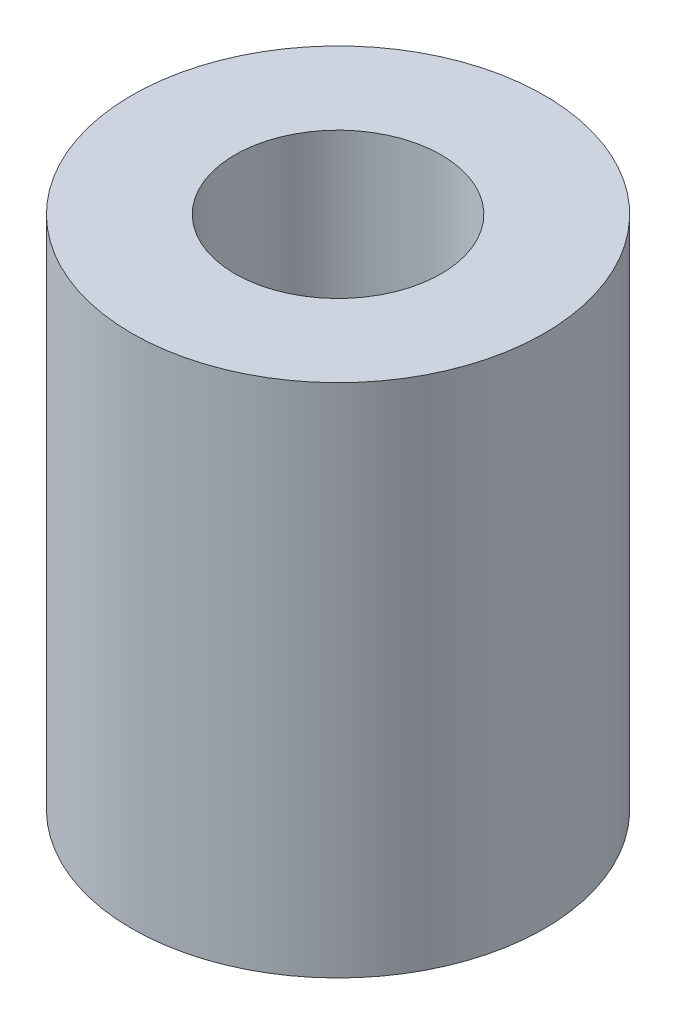
ISO-10303-21;
HEADER;
FILE_DESCRIPTION(('STEP AP214'),'2;1');
FILE_NAME('part.step','',(''),(''),'','','');
FILE_SCHEMA(('AUTOMOTIVE_DESIGN { 1 0 10303 214 1 1 1 1 }'));
ENDSEC;
DATA;
#1=APPLICATION_CONTEXT('core data for automotive mechanical design processes');
#2=APPLICATION_PROTOCOL_DEFINITION('international standard','automotive_design',2000,#1);
#3=PRODUCT_CONTEXT('',#1,'mechanical');
#4=PRODUCT('Part','Part','',(#3));
#5=PRODUCT_RELATED_PRODUCT_CATEGORY('part','',(#4));
#6=PRODUCT_DEFINITION_FORMATION('','',#4);
#7=PRODUCT_DEFINITION_CONTEXT('part definition',#1,'design');
#8=PRODUCT_DEFINITION('design','',#6,#7);
#9=PRODUCT_DEFINITION_SHAPE('','',#8);
#10=(LENGTH_UNIT() NAMED_UNIT(*) SI_UNIT(.MILLI.,.METRE.));
#11=(NAMED_UNIT(*) PLANE_ANGLE_UNIT() SI_UNIT($,.RADIAN.));
#12=(NAMED_UNIT(*) SI_UNIT($,.STERADIAN.) SOLID_ANGLE_UNIT());
#13=UNCERTAINTY_MEASURE_WITH_UNIT(LENGTH_MEASURE(1.E-05),#10,'distance_accuracy_value','');
#14=(GEOMETRIC_REPRESENTATION_CONTEXT(3) GLOBAL_UNCERTAINTY_ASSIGNED_CONTEXT((#13)) GLOBAL_UNIT_ASSIGNED_CONTEXT((#10,
#11,#12)) REPRESENTATION_CONTEXT('',''));
#15=CARTESIAN_POINT('',(0.,0.,0.));
#16=DIRECTION('',(0.,0.,1.));
#17=DIRECTION('',(1.,0.,0.));
#18=AXIS2_PLACEMENT_3D('',#15,#16,#17);
#19=CARTESIAN_POINT('',(0.,5.,0.));
#20=DIRECTION('',(0.,1.,0.));
#21=DIRECTION('',(0.,0.,1.));
#22=AXIS2_PLACEMENT_3D('',#19,#20,#21);
#23=PLANE('',#22);
#24=CARTESIAN_POINT('',(0.,5.,0.));
#25=DIRECTION('',(0.,1.,0.));
#26=DIRECTION('',(0.,0.,1.));
#27=AXIS2_PLACEMENT_3D('',#24,#25,#26);
#28=CIRCLE('',#27,2.);
#29=CARTESIAN_POINT('',(0.,5.,2.));
#30=VERTEX_POINT('',#29);
#31=EDGE_CURVE('E10',#30,#30,#28,.T.);
#32=ORIENTED_EDGE('',*,*,#31,.T.);
#33=EDGE_LOOP('',(#32));
#34=FACE_BOUND('',#33,.T.);
#35=CARTESIAN_POINT('',(0.,5.,0.));
#36=DIRECTION('',(0.,1.,0.));
#37=DIRECTION('',(0.,0.,1.));
#38=AXIS2_PLACEMENT_3D('',#35,#36,#37);
#39=CIRCLE('',#38,1.);
#40=CARTESIAN_POINT('',(0.,5.,1.));
#41=VERTEX_POINT('',#40);
#42=EDGE_CURVE('E56',#41,#41,#39,.T.);
#43=ORIENTED_EDGE('',*,*,#42,.F.);
#44=EDGE_LOOP('',(#43));
#45=FACE_BOUND('',#44,.T.);
#46=ADVANCED_FACE('F43',(#34,#45),#23,.T.);
#47=CARTESIAN_POINT('',(0.,0.,0.));
#48=DIRECTION('',(0.,1.,0.));
#49=DIRECTION('',(0.,0.,1.));
#50=AXIS2_PLACEMENT_3D('',#47,#48,#49);
#51=PLANE('',#50);
#52=CARTESIAN_POINT('',(0.,0.,0.));
#53=DIRECTION('',(0.,1.,0.));
#54=DIRECTION('',(0.,0.,1.));
#55=AXIS2_PLACEMENT_3D('',#52,#53,#54);
#56=CIRCLE('',#55,2.);
#57=CARTESIAN_POINT('',(0.,0.,2.));
#58=VERTEX_POINT('',#57);
#59=EDGE_CURVE('E47',#58,#58,#56,.T.);
#60=ORIENTED_EDGE('',*,*,#59,.F.);
#61=EDGE_LOOP('',(#60));
#62=FACE_BOUND('',#61,.T.);
#63=CARTESIAN_POINT('',(0.,0.,0.));
#64=DIRECTION('',(0.,1.,0.));
#65=DIRECTION('',(0.,0.,1.));
#66=AXIS2_PLACEMENT_3D('',#63,#64,#65);
#67=CIRCLE('',#66,1.);
#68=CARTESIAN_POINT('',(0.,0.,1.));
#69=VERTEX_POINT('',#68);
#70=EDGE_CURVE('E58',#69,#69,#67,.T.);
#71=ORIENTED_EDGE('',*,*,#70,.T.);
#72=EDGE_LOOP('',(#71));
#73=FACE_BOUND('',#72,.T.);
#74=ADVANCED_FACE('F70',(#62,#73),#51,.F.);
#75=CARTESIAN_POINT('',(0.,5.,0.));
#76=DIRECTION('',(0.,-1.,0.));
#77=DIRECTION('',(0.,0.,-1.));
#78=AXIS2_PLACEMENT_3D('',#75,#76,#77);
#79=CYLINDRICAL_SURFACE('',#78,2.);
#80=ORIENTED_EDGE('',*,*,#31,.F.);
#81=EDGE_LOOP('',(#80));
#82=FACE_BOUND('',#81,.T.);
#83=ORIENTED_EDGE('',*,*,#59,.T.);
#84=EDGE_LOOP('',(#83));
#85=FACE_BOUND('',#84,.T.);
#86=ADVANCED_FACE('F45',(#82,#85),#79,.T.);
#87=CARTESIAN_POINT('',(0.,5.,0.));
#88=DIRECTION('',(0.,-1.,0.));
#89=DIRECTION('',(0.,0.,-1.));
#90=AXIS2_PLACEMENT_3D('',#87,#88,#89);
#91=CYLINDRICAL_SURFACE('',#90,1.);
#92=ORIENTED_EDGE('',*,*,#42,.T.);
#93=EDGE_LOOP('',(#92));
#94=FACE_BOUND('',#93,.T.);
#95=ORIENTED_EDGE('',*,*,#70,.F.);
#96=EDGE_LOOP('',(#95));
#97=FACE_BOUND('',#96,.T.);
#98=ADVANCED_FACE('F66',(#94,#97),#91,.F.);
#99=CLOSED_SHELL('',(#46,#74,#86,#98));
#100=MANIFOLD_SOLID_BREP('B2',#99);
#101=ADVANCED_BREP_SHAPE_REPRESENTATION('',(#18,#100),#14);
#102=SHAPE_DEFINITION_REPRESENTATION(#9,#101);
ENDSEC;
END-ISO-10303-21;
